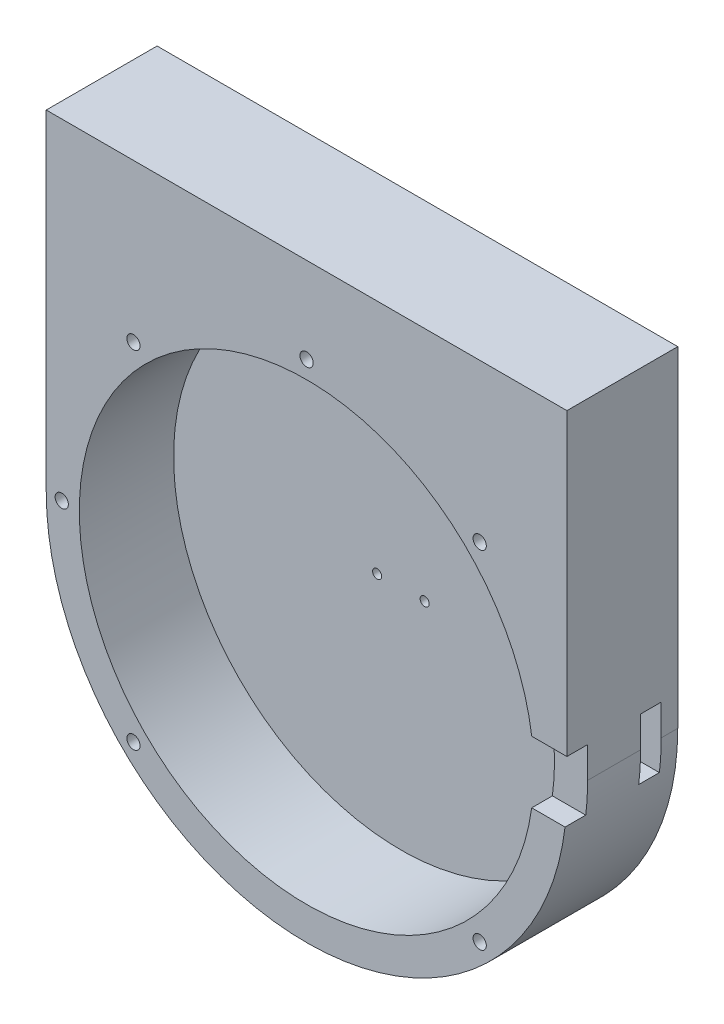
ISO-10303-21;
HEADER;
FILE_DESCRIPTION(('STEP AP214'),'2;1');
FILE_NAME('part.step','',(''),(''),'','','');
FILE_SCHEMA(('AUTOMOTIVE_DESIGN { 1 0 10303 214 1 1 1 1 }'));
ENDSEC;
DATA;
#1=APPLICATION_CONTEXT('core data for automotive mechanical design processes');
#2=APPLICATION_PROTOCOL_DEFINITION('international standard','automotive_design',2000,#1);
#3=PRODUCT_CONTEXT('',#1,'mechanical');
#4=PRODUCT('Part','Part','',(#3));
#5=PRODUCT_RELATED_PRODUCT_CATEGORY('part','',(#4));
#6=PRODUCT_DEFINITION_FORMATION('','',#4);
#7=PRODUCT_DEFINITION_CONTEXT('part definition',#1,'design');
#8=PRODUCT_DEFINITION('design','',#6,#7);
#9=PRODUCT_DEFINITION_SHAPE('','',#8);
#10=(LENGTH_UNIT() NAMED_UNIT(*) SI_UNIT(.MILLI.,.METRE.));
#11=(NAMED_UNIT(*) PLANE_ANGLE_UNIT() SI_UNIT($,.RADIAN.));
#12=(NAMED_UNIT(*) SI_UNIT($,.STERADIAN.) SOLID_ANGLE_UNIT());
#13=UNCERTAINTY_MEASURE_WITH_UNIT(LENGTH_MEASURE(1.E-05),#10,'distance_accuracy_value','');
#14=(GEOMETRIC_REPRESENTATION_CONTEXT(3) GLOBAL_UNCERTAINTY_ASSIGNED_CONTEXT((#13)) GLOBAL_UNIT_ASSIGNED_CONTEXT((#10,
#11,#12)) REPRESENTATION_CONTEXT('',''));
#15=CARTESIAN_POINT('',(0.,0.,0.));
#16=DIRECTION('',(0.,0.,1.));
#17=DIRECTION('',(1.,0.,0.));
#18=AXIS2_PLACEMENT_3D('',#15,#16,#17);
#19=CARTESIAN_POINT('',(0.,-1.18665937942703E-13,22.8250000000006));
#20=DIRECTION('',(0.,0.,-1.));
#21=DIRECTION('',(-0.707106781186544,0.70710678118655,0.));
#22=AXIS2_PLACEMENT_3D('',#19,#20,#21);
#23=PLANE('',#22);
#24=CARTESIAN_POINT('',(-41.8960767853027,41.896076785303,22.8250000000007));
#25=DIRECTION('',(0.,0.,-1.));
#26=DIRECTION('',(0.,1.,0.));
#27=AXIS2_PLACEMENT_3D('',#24,#25,#26);
#28=CIRCLE('',#27,1.6000000000001);
#29=CARTESIAN_POINT('',(-41.8960767853027,43.4960767853031,22.8250000000007));
#30=VERTEX_POINT('',#29);
#31=EDGE_CURVE('E344',#30,#30,#28,.F.);
#32=ORIENTED_EDGE('',*,*,#31,.F.);
#33=EDGE_LOOP('',(#32));
#34=FACE_BOUND('',#33,.T.);
#35=CARTESIAN_POINT('',(-41.8960767853031,-41.8960767853029,22.8250000000006));
#36=DIRECTION('',(0.,0.,-1.));
#37=DIRECTION('',(0.,1.,0.));
#38=AXIS2_PLACEMENT_3D('',#35,#36,#37);
#39=CIRCLE('',#38,1.60000000000007);
#40=CARTESIAN_POINT('',(-41.8960767853031,-40.2960767853028,22.8250000000006));
#41=VERTEX_POINT('',#40);
#42=EDGE_CURVE('E348',#41,#41,#39,.F.);
#43=ORIENTED_EDGE('',*,*,#42,.F.);
#44=EDGE_LOOP('',(#43));
#45=FACE_BOUND('',#44,.T.);
#46=CARTESIAN_POINT('',(41.8960767853028,-41.8960767853032,22.8250000000005));
#47=DIRECTION('',(0.,0.,-1.));
#48=DIRECTION('',(0.,1.,0.));
#49=AXIS2_PLACEMENT_3D('',#46,#47,#48);
#50=CIRCLE('',#49,1.60000000000006);
#51=CARTESIAN_POINT('',(41.8960767853028,-40.2960767853032,22.8250000000005));
#52=VERTEX_POINT('',#51);
#53=EDGE_CURVE('E352',#52,#52,#50,.F.);
#54=ORIENTED_EDGE('',*,*,#53,.F.);
#55=EDGE_LOOP('',(#54));
#56=FACE_BOUND('',#55,.T.);
#57=CARTESIAN_POINT('',(41.8960767853031,41.8960767853026,22.8250000000007));
#58=DIRECTION('',(0.,0.,-1.));
#59=DIRECTION('',(0.,1.,0.));
#60=AXIS2_PLACEMENT_3D('',#57,#58,#59);
#61=CIRCLE('',#60,1.60000000000009);
#62=CARTESIAN_POINT('',(41.8960767853031,43.4960767853027,22.8250000000007));
#63=VERTEX_POINT('',#62);
#64=EDGE_CURVE('E355',#63,#63,#61,.F.);
#65=ORIENTED_EDGE('',*,*,#64,.F.);
#66=EDGE_LOOP('',(#65));
#67=FACE_BOUND('',#66,.T.);
#68=CARTESIAN_POINT('',(0.,0.,22.8250000000006));
#69=DIRECTION('',(0.,0.,-1.));
#70=DIRECTION('',(0.,1.,0.));
#71=AXIS2_PLACEMENT_3D('',#68,#69,#70);
#72=CIRCLE('',#71,55.);
#73=CARTESIAN_POINT('',(54.4862367942584,-7.5,22.8250000000006));
#74=VERTEX_POINT('',#73);
#75=CARTESIAN_POINT('',(54.4862367942584,7.49999999999999,22.8250000000008));
#76=VERTEX_POINT('',#75);
#77=EDGE_CURVE('E11',#74,#76,#72,.T.);
#78=ORIENTED_EDGE('',*,*,#77,.T.);
#79=DIRECTION('',(1.,0.,0.));
#80=VECTOR('',#79,1.);
#81=CARTESIAN_POINT('',(-63.001,7.49999999999999,22.8250000000008));
#82=LINE('',#81,#80);
#83=CARTESIAN_POINT('',(63.,7.49999999999999,22.8250000000008));
#84=VERTEX_POINT('',#83);
#85=EDGE_CURVE('E208',#76,#84,#82,.T.);
#86=ORIENTED_EDGE('',*,*,#85,.T.);
#87=DIRECTION('',(0.,-1.,0.));
#88=VECTOR('',#87,1.);
#89=CARTESIAN_POINT('',(63.,80.0000000000004,22.8250000000008));
#90=LINE('',#89,#88);
#91=CARTESIAN_POINT('',(63.,80.,22.8250000000008));
#92=VERTEX_POINT('',#91);
#93=EDGE_CURVE('E258',#92,#84,#90,.T.);
#94=ORIENTED_EDGE('',*,*,#93,.F.);
#95=DIRECTION('',(1.,0.,0.));
#96=VECTOR('',#95,1.);
#97=CARTESIAN_POINT('',(-63.0000000000001,80.,22.8250000000008));
#98=LINE('',#97,#96);
#99=CARTESIAN_POINT('',(-63.,80.,22.8250000000008));
#100=VERTEX_POINT('',#99);
#101=EDGE_CURVE('E264',#100,#92,#98,.T.);
#102=ORIENTED_EDGE('',*,*,#101,.F.);
#103=DIRECTION('',(0.,1.,0.));
#104=VECTOR('',#103,1.);
#105=CARTESIAN_POINT('',(-63.,80.0000000000004,22.8250000000008));
#106=LINE('',#105,#104);
#107=CARTESIAN_POINT('',(-63.,0.,22.8250000000007));
#108=VERTEX_POINT('',#107);
#109=EDGE_CURVE('E254',#108,#100,#106,.T.);
#110=ORIENTED_EDGE('',*,*,#109,.F.);
#111=CARTESIAN_POINT('',(0.,0.,22.8250000000006));
#112=DIRECTION('',(0.,0.,-1.));
#113=DIRECTION('',(0.,1.,0.));
#114=AXIS2_PLACEMENT_3D('',#111,#112,#113);
#115=CIRCLE('',#114,63.);
#116=CARTESIAN_POINT('',(62.5519783859791,-7.5,22.8250000000008));
#117=VERTEX_POINT('',#116);
#118=EDGE_CURVE('E259',#117,#108,#115,.T.);
#119=ORIENTED_EDGE('',*,*,#118,.F.);
#120=DIRECTION('',(1.,0.,0.));
#121=VECTOR('',#120,1.);
#122=CARTESIAN_POINT('',(-63.001,-7.5,22.8250000000008));
#123=LINE('',#122,#121);
#124=EDGE_CURVE('E205',#74,#117,#123,.T.);
#125=ORIENTED_EDGE('',*,*,#124,.F.);
#126=EDGE_LOOP('',(#78,#86,#94,#102,#110,#119,#125));
#127=FACE_BOUND('',#126,.T.);
#128=CARTESIAN_POINT('',(-59.25,1.2490009027033E-13,22.8250000000007));
#129=DIRECTION('',(0.,0.,-1.));
#130=DIRECTION('',(0.,1.,0.));
#131=AXIS2_PLACEMENT_3D('',#128,#129,#130);
#132=CIRCLE('',#131,1.60000000000008);
#133=CARTESIAN_POINT('',(-57.6499999999999,1.2490009027033E-13,22.8250000000006));
#134=VERTEX_POINT('',#133);
#135=EDGE_CURVE('E538',#134,#134,#132,.T.);
#136=ORIENTED_EDGE('',*,*,#135,.T.);
#137=EDGE_LOOP('',(#136));
#138=FACE_BOUND('',#137,.T.);
#139=CARTESIAN_POINT('',(0.,59.2499999999999,22.8250000000008));
#140=DIRECTION('',(0.,0.,-1.));
#141=DIRECTION('',(0.,1.,0.));
#142=AXIS2_PLACEMENT_3D('',#139,#140,#141);
#143=CIRCLE('',#142,1.60000000000012);
#144=CARTESIAN_POINT('',(1.60000000000008,59.2499999999999,22.8250000000008));
#145=VERTEX_POINT('',#144);
#146=EDGE_CURVE('E539',#145,#145,#143,.T.);
#147=ORIENTED_EDGE('',*,*,#146,.T.);
#148=EDGE_LOOP('',(#147));
#149=FACE_BOUND('',#148,.T.);
#150=ADVANCED_FACE('F45',(#34,#45,#56,#67,#127,#138,#149),#23,.F.);
#151=CARTESIAN_POINT('',(-63.,80.,213.41618552546));
#152=DIRECTION('',(1.,0.,0.));
#153=DIRECTION('',(0.,0.,-1.));
#154=AXIS2_PLACEMENT_3D('',#151,#152,#153);
#155=PLANE('',#154);
#156=DIRECTION('',(0.,0.,-1.));
#157=VECTOR('',#156,1.);
#158=CARTESIAN_POINT('',(-63.,0.,213.41618552546));
#159=LINE('',#158,#157);
#160=CARTESIAN_POINT('',(-63.,0.,-4.));
#161=VERTEX_POINT('',#160);
#162=EDGE_CURVE('E255',#108,#161,#159,.T.);
#163=ORIENTED_EDGE('',*,*,#162,.F.);
#164=ORIENTED_EDGE('',*,*,#109,.T.);
#165=DIRECTION('',(0.,0.,-1.));
#166=VECTOR('',#165,1.);
#167=CARTESIAN_POINT('',(-63.,80.,213.41618552546));
#168=LINE('',#167,#166);
#169=CARTESIAN_POINT('',(-63.,80.,-4.));
#170=VERTEX_POINT('',#169);
#171=EDGE_CURVE('E267',#100,#170,#168,.T.);
#172=ORIENTED_EDGE('',*,*,#171,.T.);
#173=DIRECTION('',(0.,-1.,0.));
#174=VECTOR('',#173,1.);
#175=CARTESIAN_POINT('',(-63.,0.,-4.));
#176=LINE('',#175,#174);
#177=EDGE_CURVE('E167',#170,#161,#176,.T.);
#178=ORIENTED_EDGE('',*,*,#177,.T.);
#179=EDGE_LOOP('',(#163,#164,#172,#178));
#180=FACE_BOUND('',#179,.T.);
#181=ADVANCED_FACE('F290',(#180),#155,.F.);
#182=CARTESIAN_POINT('',(0.,0.,213.41618552546));
#183=DIRECTION('',(0.,0.,-1.));
#184=DIRECTION('',(-1.,0.,0.));
#185=AXIS2_PLACEMENT_3D('',#182,#183,#184);
#186=CYLINDRICAL_SURFACE('',#185,63.);
#187=CARTESIAN_POINT('',(0.,0.,17.8250000000008));
#188=DIRECTION('',(0.,0.,-1.));
#189=DIRECTION('',(0.,1.,0.));
#190=AXIS2_PLACEMENT_3D('',#187,#188,#189);
#191=CIRCLE('',#190,63.);
#192=CARTESIAN_POINT('',(62.5519783859791,-7.5,17.8250000000008));
#193=VERTEX_POINT('',#192);
#194=CARTESIAN_POINT('',(63.,0.,17.8250000000008));
#195=VERTEX_POINT('',#194);
#196=EDGE_CURVE('E183',#193,#195,#191,.F.);
#197=ORIENTED_EDGE('',*,*,#196,.F.);
#198=DIRECTION('',(0.,0.,-1.));
#199=VECTOR('',#198,1.);
#200=CARTESIAN_POINT('',(62.5519783859791,-7.50000000000003,213.41618552546));
#201=LINE('',#200,#199);
#202=EDGE_CURVE('E179',#117,#193,#201,.T.);
#203=ORIENTED_EDGE('',*,*,#202,.F.);
#204=ORIENTED_EDGE('',*,*,#118,.T.);
#205=ORIENTED_EDGE('',*,*,#162,.T.);
#206=CARTESIAN_POINT('',(0.,0.,-4.));
#207=DIRECTION('',(0.,0.,1.));
#208=DIRECTION('',(1.,0.,0.));
#209=AXIS2_PLACEMENT_3D('',#206,#207,#208);
#210=CIRCLE('',#209,63.);
#211=CARTESIAN_POINT('',(63.,0.,-4.));
#212=VERTEX_POINT('',#211);
#213=EDGE_CURVE('E165',#161,#212,#210,.T.);
#214=ORIENTED_EDGE('',*,*,#213,.T.);
#215=DIRECTION('',(0.,0.,1.));
#216=VECTOR('',#215,1.);
#217=CARTESIAN_POINT('',(63.,0.,-198.591185525459));
#218=LINE('',#217,#216);
#219=CARTESIAN_POINT('',(63.,0.,0.));
#220=VERTEX_POINT('',#219);
#221=EDGE_CURVE('E147',#212,#220,#218,.T.);
#222=ORIENTED_EDGE('',*,*,#221,.T.);
#223=CARTESIAN_POINT('',(0.,0.,0.));
#224=DIRECTION('',(0.,0.,-1.));
#225=DIRECTION('',(-1.,0.,0.));
#226=AXIS2_PLACEMENT_3D('',#223,#224,#225);
#227=CIRCLE('',#226,63.);
#228=CARTESIAN_POINT('',(62.5519783859791,-7.5,0.));
#229=VERTEX_POINT('',#228);
#230=EDGE_CURVE('E155',#220,#229,#227,.T.);
#231=ORIENTED_EDGE('',*,*,#230,.T.);
#232=DIRECTION('',(0.,0.,-1.));
#233=VECTOR('',#232,1.);
#234=CARTESIAN_POINT('',(62.5519783859791,-7.5,213.41618552546));
#235=LINE('',#234,#233);
#236=CARTESIAN_POINT('',(62.5519783859791,-7.5,5.));
#237=VERTEX_POINT('',#236);
#238=EDGE_CURVE('E246',#237,#229,#235,.T.);
#239=ORIENTED_EDGE('',*,*,#238,.F.);
#240=CARTESIAN_POINT('',(0.,0.,5.));
#241=DIRECTION('',(0.,0.,1.));
#242=DIRECTION('',(0.,-1.,0.));
#243=AXIS2_PLACEMENT_3D('',#240,#241,#242);
#244=CIRCLE('',#243,63.);
#245=CARTESIAN_POINT('',(63.,0.,5.));
#246=VERTEX_POINT('',#245);
#247=EDGE_CURVE('E184',#246,#237,#244,.F.);
#248=ORIENTED_EDGE('',*,*,#247,.F.);
#249=DIRECTION('',(0.,0.,-1.));
#250=VECTOR('',#249,1.);
#251=CARTESIAN_POINT('',(63.,0.,213.41618552546));
#252=LINE('',#251,#250);
#253=EDGE_CURVE('E260',#195,#246,#252,.T.);
#254=ORIENTED_EDGE('',*,*,#253,.F.);
#255=EDGE_LOOP('',(#197,#203,#204,#205,#214,#222,#231,#239,#248,#254));
#256=FACE_BOUND('',#255,.T.);
#257=ADVANCED_FACE('F161',(#256),#186,.T.);
#258=CARTESIAN_POINT('',(63.,80.,213.41618552546));
#259=DIRECTION('',(-1.,0.,0.));
#260=DIRECTION('',(0.,0.,1.));
#261=AXIS2_PLACEMENT_3D('',#258,#259,#260);
#262=PLANE('',#261);
#263=ORIENTED_EDGE('',*,*,#93,.T.);
#264=DIRECTION('',(0.,0.,1.));
#265=VECTOR('',#264,1.);
#266=CARTESIAN_POINT('',(63.,7.5,17.8250000000008));
#267=LINE('',#266,#265);
#268=CARTESIAN_POINT('',(63.,7.5,17.8250000000008));
#269=VERTEX_POINT('',#268);
#270=EDGE_CURVE('E197',#269,#84,#267,.T.);
#271=ORIENTED_EDGE('',*,*,#270,.F.);
#272=DIRECTION('',(0.,1.,0.));
#273=VECTOR('',#272,1.);
#274=CARTESIAN_POINT('',(63.,-7.5,17.8250000000008));
#275=LINE('',#274,#273);
#276=EDGE_CURVE('E193',#195,#269,#275,.T.);
#277=ORIENTED_EDGE('',*,*,#276,.F.);
#278=ORIENTED_EDGE('',*,*,#253,.T.);
#279=DIRECTION('',(0.,-1.,0.));
#280=VECTOR('',#279,1.);
#281=CARTESIAN_POINT('',(63.,7.5,5.));
#282=LINE('',#281,#280);
#283=CARTESIAN_POINT('',(63.,7.5,5.));
#284=VERTEX_POINT('',#283);
#285=EDGE_CURVE('E226',#284,#246,#282,.T.);
#286=ORIENTED_EDGE('',*,*,#285,.F.);
#287=DIRECTION('',(0.,0.,1.));
#288=VECTOR('',#287,1.);
#289=CARTESIAN_POINT('',(63.,7.5,0.));
#290=LINE('',#289,#288);
#291=CARTESIAN_POINT('',(63.,7.5,0.));
#292=VERTEX_POINT('',#291);
#293=EDGE_CURVE('E150',#292,#284,#290,.T.);
#294=ORIENTED_EDGE('',*,*,#293,.F.);
#295=DIRECTION('',(0.,-1.,0.));
#296=VECTOR('',#295,1.);
#297=CARTESIAN_POINT('',(63.,80.,0.));
#298=LINE('',#297,#296);
#299=EDGE_CURVE('E142',#292,#220,#298,.T.);
#300=ORIENTED_EDGE('',*,*,#299,.T.);
#301=ORIENTED_EDGE('',*,*,#221,.F.);
#302=DIRECTION('',(0.,1.,0.));
#303=VECTOR('',#302,1.);
#304=CARTESIAN_POINT('',(63.,80.,-4.));
#305=LINE('',#304,#303);
#306=CARTESIAN_POINT('',(63.,80.,-4.));
#307=VERTEX_POINT('',#306);
#308=EDGE_CURVE('E295',#212,#307,#305,.T.);
#309=ORIENTED_EDGE('',*,*,#308,.T.);
#310=DIRECTION('',(0.,0.,-1.));
#311=VECTOR('',#310,1.);
#312=CARTESIAN_POINT('',(63.,80.,213.41618552546));
#313=LINE('',#312,#311);
#314=EDGE_CURVE('E53',#92,#307,#313,.T.);
#315=ORIENTED_EDGE('',*,*,#314,.F.);
#316=EDGE_LOOP('',(#263,#271,#277,#278,#286,#294,#300,#301,#309,#315));
#317=FACE_BOUND('',#316,.T.);
#318=ADVANCED_FACE('F145',(#317),#262,.F.);
#319=CARTESIAN_POINT('',(-63.,80.,213.41618552546));
#320=DIRECTION('',(0.,-1.,0.));
#321=DIRECTION('',(0.,0.,-1.));
#322=AXIS2_PLACEMENT_3D('',#319,#320,#321);
#323=PLANE('',#322);
#324=ORIENTED_EDGE('',*,*,#171,.F.);
#325=ORIENTED_EDGE('',*,*,#101,.T.);
#326=ORIENTED_EDGE('',*,*,#314,.T.);
#327=DIRECTION('',(-1.,0.,0.));
#328=VECTOR('',#327,1.);
#329=CARTESIAN_POINT('',(-63.,80.,-4.));
#330=LINE('',#329,#328);
#331=EDGE_CURVE('E223',#307,#170,#330,.T.);
#332=ORIENTED_EDGE('',*,*,#331,.T.);
#333=EDGE_LOOP('',(#324,#325,#326,#332));
#334=FACE_BOUND('',#333,.T.);
#335=ADVANCED_FACE('F280',(#334),#323,.F.);
#336=CARTESIAN_POINT('',(0.,0.,213.41618552546));
#337=DIRECTION('',(0.,0.,-1.));
#338=DIRECTION('',(-1.,0.,0.));
#339=AXIS2_PLACEMENT_3D('',#336,#337,#338);
#340=CYLINDRICAL_SURFACE('',#339,55.);
#341=DIRECTION('',(0.,0.,-1.));
#342=VECTOR('',#341,1.);
#343=CARTESIAN_POINT('',(54.4862367942585,7.49999999999963,213.41618552546));
#344=LINE('',#343,#342);
#345=CARTESIAN_POINT('',(54.4862367942585,7.49999999999963,17.8250000000008));
#346=VERTEX_POINT('',#345);
#347=EDGE_CURVE('E204',#346,#76,#344,.F.);
#348=ORIENTED_EDGE('',*,*,#347,.T.);
#349=ORIENTED_EDGE('',*,*,#77,.F.);
#350=DIRECTION('',(0.,0.,-1.));
#351=VECTOR('',#350,1.);
#352=CARTESIAN_POINT('',(54.4862367942584,-7.50000000000003,213.41618552546));
#353=LINE('',#352,#351);
#354=CARTESIAN_POINT('',(54.4862367942584,-7.5,17.8250000000008));
#355=VERTEX_POINT('',#354);
#356=EDGE_CURVE('E68',#74,#355,#353,.T.);
#357=ORIENTED_EDGE('',*,*,#356,.T.);
#358=CARTESIAN_POINT('',(0.,0.,17.8250000000008));
#359=DIRECTION('',(0.,0.,-1.));
#360=DIRECTION('',(0.,1.,0.));
#361=AXIS2_PLACEMENT_3D('',#358,#359,#360);
#362=CIRCLE('',#361,55.);
#363=EDGE_CURVE('E187',#355,#346,#362,.F.);
#364=ORIENTED_EDGE('',*,*,#363,.T.);
#365=EDGE_LOOP('',(#348,#349,#357,#364));
#366=FACE_BOUND('',#365,.T.);
#367=DIRECTION('',(0.,0.,-1.));
#368=VECTOR('',#367,1.);
#369=CARTESIAN_POINT('',(54.4862367942584,-7.5,213.41618552546));
#370=LINE('',#369,#368);
#371=CARTESIAN_POINT('',(54.4862367942584,-7.5,5.));
#372=VERTEX_POINT('',#371);
#373=CARTESIAN_POINT('',(54.4862367942584,-7.5,0.));
#374=VERTEX_POINT('',#373);
#375=EDGE_CURVE('E242',#372,#374,#370,.T.);
#376=ORIENTED_EDGE('',*,*,#375,.T.);
#377=CARTESIAN_POINT('',(0.,0.,0.));
#378=DIRECTION('',(0.,0.,1.));
#379=DIRECTION('',(1.,0.,0.));
#380=AXIS2_PLACEMENT_3D('',#377,#378,#379);
#381=CIRCLE('',#380,55.);
#382=CARTESIAN_POINT('',(54.4862367942584,7.5,0.));
#383=VERTEX_POINT('',#382);
#384=EDGE_CURVE('E217',#383,#374,#381,.T.);
#385=ORIENTED_EDGE('',*,*,#384,.F.);
#386=DIRECTION('',(0.,0.,-1.));
#387=VECTOR('',#386,1.);
#388=CARTESIAN_POINT('',(54.4862367942584,7.49999999999993,213.41618552546));
#389=LINE('',#388,#387);
#390=CARTESIAN_POINT('',(54.4862367942584,7.49999999999993,5.));
#391=VERTEX_POINT('',#390);
#392=EDGE_CURVE('E238',#383,#391,#389,.F.);
#393=ORIENTED_EDGE('',*,*,#392,.T.);
#394=CARTESIAN_POINT('',(0.,0.,5.));
#395=DIRECTION('',(0.,0.,1.));
#396=DIRECTION('',(0.,-1.,0.));
#397=AXIS2_PLACEMENT_3D('',#394,#395,#396);
#398=CIRCLE('',#397,55.);
#399=EDGE_CURVE('E218',#391,#372,#398,.F.);
#400=ORIENTED_EDGE('',*,*,#399,.T.);
#401=EDGE_LOOP('',(#376,#385,#393,#400));
#402=FACE_BOUND('',#401,.T.);
#403=ADVANCED_FACE('F312',(#366,#402),#340,.F.);
#404=CARTESIAN_POINT('',(-63.001,7.5,17.8250000000008));
#405=DIRECTION('',(0.,1.,0.));
#406=DIRECTION('',(0.,0.,1.));
#407=AXIS2_PLACEMENT_3D('',#404,#405,#406);
#408=PLANE('',#407);
#409=DIRECTION('',(1.,0.,0.));
#410=VECTOR('',#409,1.);
#411=CARTESIAN_POINT('',(-63.001,7.5,17.8250000000008));
#412=LINE('',#411,#410);
#413=EDGE_CURVE('E200',#346,#269,#412,.T.);
#414=ORIENTED_EDGE('',*,*,#413,.T.);
#415=ORIENTED_EDGE('',*,*,#270,.T.);
#416=ORIENTED_EDGE('',*,*,#85,.F.);
#417=ORIENTED_EDGE('',*,*,#347,.F.);
#418=EDGE_LOOP('',(#414,#415,#416,#417));
#419=FACE_BOUND('',#418,.T.);
#420=ADVANCED_FACE('F308',(#419),#408,.F.);
#421=CARTESIAN_POINT('',(-63.001,-7.5,17.8250000000008));
#422=DIRECTION('',(0.,-1.,0.));
#423=DIRECTION('',(0.,0.,-1.));
#424=AXIS2_PLACEMENT_3D('',#421,#422,#423);
#425=PLANE('',#424);
#426=ORIENTED_EDGE('',*,*,#202,.T.);
#427=DIRECTION('',(1.,0.,0.));
#428=VECTOR('',#427,1.);
#429=CARTESIAN_POINT('',(-63.001,-7.5,17.8250000000008));
#430=LINE('',#429,#428);
#431=EDGE_CURVE('E201',#355,#193,#430,.T.);
#432=ORIENTED_EDGE('',*,*,#431,.F.);
#433=ORIENTED_EDGE('',*,*,#356,.F.);
#434=ORIENTED_EDGE('',*,*,#124,.T.);
#435=EDGE_LOOP('',(#426,#432,#433,#434));
#436=FACE_BOUND('',#435,.T.);
#437=ADVANCED_FACE('F330',(#436),#425,.F.);
#438=CARTESIAN_POINT('',(-63.001,-7.5,17.8250000000008));
#439=DIRECTION('',(0.,0.,-1.));
#440=DIRECTION('',(0.,1.,0.));
#441=AXIS2_PLACEMENT_3D('',#438,#439,#440);
#442=PLANE('',#441);
#443=ORIENTED_EDGE('',*,*,#196,.T.);
#444=ORIENTED_EDGE('',*,*,#276,.T.);
#445=ORIENTED_EDGE('',*,*,#413,.F.);
#446=ORIENTED_EDGE('',*,*,#363,.F.);
#447=ORIENTED_EDGE('',*,*,#431,.T.);
#448=EDGE_LOOP('',(#443,#444,#445,#446,#447));
#449=FACE_BOUND('',#448,.T.);
#450=ADVANCED_FACE('F315',(#449),#442,.F.);
#451=CARTESIAN_POINT('',(-63.001,7.5,5.));
#452=DIRECTION('',(0.,0.,1.));
#453=DIRECTION('',(0.,-1.,0.));
#454=AXIS2_PLACEMENT_3D('',#451,#452,#453);
#455=PLANE('',#454);
#456=ORIENTED_EDGE('',*,*,#247,.T.);
#457=DIRECTION('',(1.,0.,0.));
#458=VECTOR('',#457,1.);
#459=CARTESIAN_POINT('',(-63.001,-7.5,5.));
#460=LINE('',#459,#458);
#461=EDGE_CURVE('E227',#372,#237,#460,.T.);
#462=ORIENTED_EDGE('',*,*,#461,.F.);
#463=ORIENTED_EDGE('',*,*,#399,.F.);
#464=DIRECTION('',(1.,0.,0.));
#465=VECTOR('',#464,1.);
#466=CARTESIAN_POINT('',(-63.001,7.5,5.));
#467=LINE('',#466,#465);
#468=EDGE_CURVE('E60',#391,#284,#467,.T.);
#469=ORIENTED_EDGE('',*,*,#468,.T.);
#470=ORIENTED_EDGE('',*,*,#285,.T.);
#471=EDGE_LOOP('',(#456,#462,#463,#469,#470));
#472=FACE_BOUND('',#471,.T.);
#473=ADVANCED_FACE('F318',(#472),#455,.F.);
#474=CARTESIAN_POINT('',(-63.001,-7.5,5.));
#475=DIRECTION('',(0.,-1.,0.));
#476=DIRECTION('',(0.,0.,-1.));
#477=AXIS2_PLACEMENT_3D('',#474,#475,#476);
#478=PLANE('',#477);
#479=ORIENTED_EDGE('',*,*,#238,.T.);
#480=DIRECTION('',(1.,0.,0.));
#481=VECTOR('',#480,1.);
#482=CARTESIAN_POINT('',(-63.001,-7.5,0.));
#483=LINE('',#482,#481);
#484=EDGE_CURVE('E171',#374,#229,#483,.T.);
#485=ORIENTED_EDGE('',*,*,#484,.F.);
#486=ORIENTED_EDGE('',*,*,#375,.F.);
#487=ORIENTED_EDGE('',*,*,#461,.T.);
#488=EDGE_LOOP('',(#479,#485,#486,#487));
#489=FACE_BOUND('',#488,.T.);
#490=ADVANCED_FACE('F323',(#489),#478,.F.);
#491=CARTESIAN_POINT('',(-63.001,7.5,0.));
#492=DIRECTION('',(0.,1.,0.));
#493=DIRECTION('',(0.,0.,1.));
#494=AXIS2_PLACEMENT_3D('',#491,#492,#493);
#495=PLANE('',#494);
#496=DIRECTION('',(1.,0.,0.));
#497=VECTOR('',#496,1.);
#498=CARTESIAN_POINT('',(-63.001,7.5,0.));
#499=LINE('',#498,#497);
#500=EDGE_CURVE('E222',#383,#292,#499,.T.);
#501=ORIENTED_EDGE('',*,*,#500,.T.);
#502=ORIENTED_EDGE('',*,*,#293,.T.);
#503=ORIENTED_EDGE('',*,*,#468,.F.);
#504=ORIENTED_EDGE('',*,*,#392,.F.);
#505=EDGE_LOOP('',(#501,#502,#503,#504));
#506=FACE_BOUND('',#505,.T.);
#507=ADVANCED_FACE('F320',(#506),#495,.F.);
#508=CARTESIAN_POINT('',(0.,0.,0.));
#509=DIRECTION('',(0.,0.,-1.));
#510=DIRECTION('',(-1.,0.,0.));
#511=AXIS2_PLACEMENT_3D('',#508,#509,#510);
#512=PLANE('',#511);
#513=CARTESIAN_POINT('',(5.75,0.,0.));
#514=DIRECTION('',(0.,0.,-1.));
#515=DIRECTION('',(-1.,0.,0.));
#516=AXIS2_PLACEMENT_3D('',#513,#514,#515);
#517=CIRCLE('',#516,1.10000000000001);
#518=CARTESIAN_POINT('',(4.64999999999999,0.,0.));
#519=VERTEX_POINT('',#518);
#520=EDGE_CURVE('E156',#519,#519,#517,.F.);
#521=ORIENTED_EDGE('',*,*,#520,.F.);
#522=EDGE_LOOP('',(#521));
#523=FACE_BOUND('',#522,.T.);
#524=CARTESIAN_POINT('',(-5.75,0.,0.));
#525=DIRECTION('',(0.,0.,-1.));
#526=DIRECTION('',(-1.,0.,0.));
#527=AXIS2_PLACEMENT_3D('',#524,#525,#526);
#528=CIRCLE('',#527,1.1);
#529=CARTESIAN_POINT('',(-6.85,0.,0.));
#530=VERTEX_POINT('',#529);
#531=EDGE_CURVE('E358',#530,#530,#528,.F.);
#532=ORIENTED_EDGE('',*,*,#531,.F.);
#533=EDGE_LOOP('',(#532));
#534=FACE_BOUND('',#533,.T.);
#535=ORIENTED_EDGE('',*,*,#384,.T.);
#536=ORIENTED_EDGE('',*,*,#484,.T.);
#537=ORIENTED_EDGE('',*,*,#230,.F.);
#538=ORIENTED_EDGE('',*,*,#299,.F.);
#539=ORIENTED_EDGE('',*,*,#500,.F.);
#540=EDGE_LOOP('',(#535,#536,#537,#538,#539));
#541=FACE_BOUND('',#540,.T.);
#542=ADVANCED_FACE('F169',(#523,#534,#541),#512,.F.);
#543=CARTESIAN_POINT('',(0.,-0.01892492878625,-4.));
#544=DIRECTION('',(0.,0.,1.));
#545=DIRECTION('',(1.,0.,0.));
#546=AXIS2_PLACEMENT_3D('',#543,#544,#545);
#547=PLANE('',#546);
#548=CARTESIAN_POINT('',(-41.8960767853027,41.896076785303,-4.));
#549=DIRECTION('',(0.,0.,-1.));
#550=DIRECTION('',(-1.,0.,0.));
#551=AXIS2_PLACEMENT_3D('',#548,#549,#550);
#552=CIRCLE('',#551,1.6000000000001);
#553=CARTESIAN_POINT('',(-43.4960767853028,41.896076785303,-4.));
#554=VERTEX_POINT('',#553);
#555=EDGE_CURVE('E562',#554,#554,#552,.T.);
#556=ORIENTED_EDGE('',*,*,#555,.F.);
#557=EDGE_LOOP('',(#556));
#558=FACE_BOUND('',#557,.T.);
#559=CARTESIAN_POINT('',(-41.8960767853031,-41.8960767853029,-4.));
#560=DIRECTION('',(0.,0.,-1.));
#561=DIRECTION('',(-1.,0.,0.));
#562=AXIS2_PLACEMENT_3D('',#559,#560,#561);
#563=CIRCLE('',#562,1.60000000000007);
#564=CARTESIAN_POINT('',(-43.4960767853032,-41.8960767853029,-4.));
#565=VERTEX_POINT('',#564);
#566=EDGE_CURVE('E556',#565,#565,#563,.T.);
#567=ORIENTED_EDGE('',*,*,#566,.F.);
#568=EDGE_LOOP('',(#567));
#569=FACE_BOUND('',#568,.T.);
#570=CARTESIAN_POINT('',(41.8960767853028,-41.8960767853032,-4.));
#571=DIRECTION('',(0.,0.,-1.));
#572=DIRECTION('',(-1.,0.,0.));
#573=AXIS2_PLACEMENT_3D('',#570,#571,#572);
#574=CIRCLE('',#573,1.60000000000006);
#575=CARTESIAN_POINT('',(40.2960767853027,-41.8960767853032,-4.));
#576=VERTEX_POINT('',#575);
#577=EDGE_CURVE('E550',#576,#576,#574,.T.);
#578=ORIENTED_EDGE('',*,*,#577,.F.);
#579=EDGE_LOOP('',(#578));
#580=FACE_BOUND('',#579,.T.);
#581=CARTESIAN_POINT('',(41.8960767853031,41.8960767853026,-4.));
#582=DIRECTION('',(0.,0.,-1.));
#583=DIRECTION('',(-1.,0.,0.));
#584=AXIS2_PLACEMENT_3D('',#581,#582,#583);
#585=CIRCLE('',#584,1.60000000000009);
#586=CARTESIAN_POINT('',(40.2960767853031,41.8960767853026,-4.));
#587=VERTEX_POINT('',#586);
#588=EDGE_CURVE('E359',#587,#587,#585,.T.);
#589=ORIENTED_EDGE('',*,*,#588,.F.);
#590=EDGE_LOOP('',(#589));
#591=FACE_BOUND('',#590,.T.);
#592=CARTESIAN_POINT('',(5.75,0.,-4.));
#593=DIRECTION('',(0.,0.,-1.));
#594=DIRECTION('',(-1.,0.,0.));
#595=AXIS2_PLACEMENT_3D('',#592,#593,#594);
#596=CIRCLE('',#595,1.10000000000001);
#597=CARTESIAN_POINT('',(4.64999999999999,0.,-4.));
#598=VERTEX_POINT('',#597);
#599=EDGE_CURVE('E368',#598,#598,#596,.T.);
#600=ORIENTED_EDGE('',*,*,#599,.F.);
#601=EDGE_LOOP('',(#600));
#602=FACE_BOUND('',#601,.T.);
#603=CARTESIAN_POINT('',(-5.75,0.,-4.));
#604=DIRECTION('',(0.,0.,-1.));
#605=DIRECTION('',(-1.,0.,0.));
#606=AXIS2_PLACEMENT_3D('',#603,#604,#605);
#607=CIRCLE('',#606,1.1);
#608=CARTESIAN_POINT('',(-6.85,0.,-4.));
#609=VERTEX_POINT('',#608);
#610=EDGE_CURVE('E301',#609,#609,#607,.T.);
#611=ORIENTED_EDGE('',*,*,#610,.F.);
#612=EDGE_LOOP('',(#611));
#613=FACE_BOUND('',#612,.T.);
#614=ORIENTED_EDGE('',*,*,#308,.F.);
#615=ORIENTED_EDGE('',*,*,#213,.F.);
#616=ORIENTED_EDGE('',*,*,#177,.F.);
#617=ORIENTED_EDGE('',*,*,#331,.F.);
#618=EDGE_LOOP('',(#614,#615,#616,#617));
#619=FACE_BOUND('',#618,.T.);
#620=ADVANCED_FACE('F294',(#558,#569,#580,#591,#602,#613,#619),#547,.F.);
#621=CARTESIAN_POINT('',(-5.75,0.,22.8260000000008));
#622=DIRECTION('',(0.,0.,-1.));
#623=DIRECTION('',(-1.,0.,0.));
#624=AXIS2_PLACEMENT_3D('',#621,#622,#623);
#625=CYLINDRICAL_SURFACE('',#624,1.1);
#626=ORIENTED_EDGE('',*,*,#610,.T.);
#627=EDGE_LOOP('',(#626));
#628=FACE_BOUND('',#627,.T.);
#629=ORIENTED_EDGE('',*,*,#531,.T.);
#630=EDGE_LOOP('',(#629));
#631=FACE_BOUND('',#630,.T.);
#632=ADVANCED_FACE('F383',(#628,#631),#625,.F.);
#633=CARTESIAN_POINT('',(5.75,0.,22.8260000000008));
#634=DIRECTION('',(0.,0.,-1.));
#635=DIRECTION('',(-1.,0.,0.));
#636=AXIS2_PLACEMENT_3D('',#633,#634,#635);
#637=CYLINDRICAL_SURFACE('',#636,1.10000000000001);
#638=ORIENTED_EDGE('',*,*,#599,.T.);
#639=EDGE_LOOP('',(#638));
#640=FACE_BOUND('',#639,.T.);
#641=ORIENTED_EDGE('',*,*,#520,.T.);
#642=EDGE_LOOP('',(#641));
#643=FACE_BOUND('',#642,.T.);
#644=ADVANCED_FACE('F376',(#640,#643),#637,.F.);
#645=CARTESIAN_POINT('',(41.8960767853031,41.8960767853026,22.8260000000008));
#646=DIRECTION('',(0.,0.,-1.));
#647=DIRECTION('',(-1.,0.,0.));
#648=AXIS2_PLACEMENT_3D('',#645,#646,#647);
#649=CYLINDRICAL_SURFACE('',#648,1.60000000000009);
#650=ORIENTED_EDGE('',*,*,#588,.T.);
#651=EDGE_LOOP('',(#650));
#652=FACE_BOUND('',#651,.T.);
#653=ORIENTED_EDGE('',*,*,#64,.T.);
#654=EDGE_LOOP('',(#653));
#655=FACE_BOUND('',#654,.T.);
#656=ADVANCED_FACE('F390',(#652,#655),#649,.F.);
#657=CARTESIAN_POINT('',(41.8960767853028,-41.8960767853032,22.8260000000008));
#658=DIRECTION('',(0.,0.,-1.));
#659=DIRECTION('',(-1.,0.,0.));
#660=AXIS2_PLACEMENT_3D('',#657,#658,#659);
#661=CYLINDRICAL_SURFACE('',#660,1.60000000000006);
#662=ORIENTED_EDGE('',*,*,#577,.T.);
#663=EDGE_LOOP('',(#662));
#664=FACE_BOUND('',#663,.T.);
#665=ORIENTED_EDGE('',*,*,#53,.T.);
#666=EDGE_LOOP('',(#665));
#667=FACE_BOUND('',#666,.T.);
#668=ADVANCED_FACE('F458',(#664,#667),#661,.F.);
#669=CARTESIAN_POINT('',(-41.8960767853031,-41.8960767853029,22.8260000000008));
#670=DIRECTION('',(0.,0.,-1.));
#671=DIRECTION('',(-1.,0.,0.));
#672=AXIS2_PLACEMENT_3D('',#669,#670,#671);
#673=CYLINDRICAL_SURFACE('',#672,1.60000000000007);
#674=ORIENTED_EDGE('',*,*,#566,.T.);
#675=EDGE_LOOP('',(#674));
#676=FACE_BOUND('',#675,.T.);
#677=ORIENTED_EDGE('',*,*,#42,.T.);
#678=EDGE_LOOP('',(#677));
#679=FACE_BOUND('',#678,.T.);
#680=ADVANCED_FACE('F467',(#676,#679),#673,.F.);
#681=CARTESIAN_POINT('',(-41.8960767853027,41.896076785303,22.8260000000008));
#682=DIRECTION('',(0.,0.,-1.));
#683=DIRECTION('',(-1.,0.,0.));
#684=AXIS2_PLACEMENT_3D('',#681,#682,#683);
#685=CYLINDRICAL_SURFACE('',#684,1.6000000000001);
#686=ORIENTED_EDGE('',*,*,#555,.T.);
#687=EDGE_LOOP('',(#686));
#688=FACE_BOUND('',#687,.T.);
#689=ORIENTED_EDGE('',*,*,#31,.T.);
#690=EDGE_LOOP('',(#689));
#691=FACE_BOUND('',#690,.T.);
#692=ADVANCED_FACE('F477',(#688,#691),#685,.F.);
#693=CARTESIAN_POINT('',(-59.25,1.2490009027033E-13,19.8250000000007));
#694=DIRECTION('',(0.,0.,1.));
#695=DIRECTION('',(1.,0.,0.));
#696=AXIS2_PLACEMENT_3D('',#693,#694,#695);
#697=CYLINDRICAL_SURFACE('',#696,1.60000000000008);
#698=CARTESIAN_POINT('',(-59.25,1.2490009027033E-13,19.8250000000007));
#699=DIRECTION('',(0.,0.,-1.));
#700=DIRECTION('',(0.,1.,0.));
#701=AXIS2_PLACEMENT_3D('',#698,#699,#700);
#702=CIRCLE('',#701,1.60000000000008);
#703=CARTESIAN_POINT('',(-57.6499999999999,1.2490009027033E-13,19.8250000000007));
#704=VERTEX_POINT('',#703);
#705=EDGE_CURVE('E544',#704,#704,#702,.T.);
#706=CARTESIAN_POINT('',(-57.6499999999999,1.2490009027033E-13,19.8250000000007));
#707=CARTESIAN_POINT('',(-57.6499999999999,1.2490009027033E-13,19.8562500000007));
#708=CARTESIAN_POINT('',(-57.6499999999999,1.2490009027033E-13,19.8875000000006));
#709=CARTESIAN_POINT('',(-57.6499999999999,1.2490009027033E-13,19.9500000000007));
#710=CARTESIAN_POINT('',(-57.6499999999999,1.2490009027033E-13,19.9812500000007));
#711=CARTESIAN_POINT('',(-57.6499999999999,1.2490009027033E-13,20.0437500000007));
#712=CARTESIAN_POINT('',(-57.6499999999999,1.2490009027033E-13,20.0750000000007));
#713=CARTESIAN_POINT('',(-57.6499999999999,1.2490009027033E-13,20.1375000000007));
#714=CARTESIAN_POINT('',(-57.6499999999999,1.2490009027033E-13,20.1687500000007));
#715=CARTESIAN_POINT('',(-57.6499999999999,1.2490009027033E-13,20.2312500000007));
#716=CARTESIAN_POINT('',(-57.6499999999999,1.2490009027033E-13,20.2625000000007));
#717=CARTESIAN_POINT('',(-57.6499999999999,1.2490009027033E-13,20.3250000000007));
#718=CARTESIAN_POINT('',(-57.6499999999999,1.2490009027033E-13,20.3562500000007));
#719=CARTESIAN_POINT('',(-57.6499999999999,1.2490009027033E-13,20.4187500000007));
#720=CARTESIAN_POINT('',(-57.6499999999999,1.2490009027033E-13,20.4500000000007));
#721=CARTESIAN_POINT('',(-57.6499999999999,1.2490009027033E-13,20.5125000000007));
#722=CARTESIAN_POINT('',(-57.6499999999999,1.2490009027033E-13,20.5437500000007));
#723=CARTESIAN_POINT('',(-57.6499999999999,1.2490009027033E-13,20.6062500000007));
#724=CARTESIAN_POINT('',(-57.6499999999999,1.2490009027033E-13,20.6375000000007));
#725=CARTESIAN_POINT('',(-57.6499999999999,1.2490009027033E-13,20.7000000000007));
#726=CARTESIAN_POINT('',(-57.6499999999999,1.2490009027033E-13,20.7312500000007));
#727=CARTESIAN_POINT('',(-57.6499999999999,1.2490009027033E-13,20.7937500000007));
#728=CARTESIAN_POINT('',(-57.6499999999999,1.2490009027033E-13,20.8250000000007));
#729=CARTESIAN_POINT('',(-57.6499999999999,1.2490009027033E-13,20.8875000000007));
#730=CARTESIAN_POINT('',(-57.6499999999999,1.2490009027033E-13,20.9187500000007));
#731=CARTESIAN_POINT('',(-57.6499999999999,1.2490009027033E-13,20.9812500000007));
#732=CARTESIAN_POINT('',(-57.6499999999999,1.2490009027033E-13,21.0125000000007));
#733=CARTESIAN_POINT('',(-57.6499999999999,1.2490009027033E-13,21.0750000000007));
#734=CARTESIAN_POINT('',(-57.6499999999999,1.2490009027033E-13,21.1062500000007));
#735=CARTESIAN_POINT('',(-57.6499999999999,1.2490009027033E-13,21.1687500000007));
#736=CARTESIAN_POINT('',(-57.6499999999999,1.2490009027033E-13,21.2000000000007));
#737=CARTESIAN_POINT('',(-57.6499999999999,1.2490009027033E-13,21.2625000000007));
#738=CARTESIAN_POINT('',(-57.6499999999999,1.2490009027033E-13,21.2937500000007));
#739=CARTESIAN_POINT('',(-57.6499999999999,1.2490009027033E-13,21.3562500000007));
#740=CARTESIAN_POINT('',(-57.6499999999999,1.2490009027033E-13,21.3875000000007));
#741=CARTESIAN_POINT('',(-57.6499999999999,1.2490009027033E-13,21.4500000000007));
#742=CARTESIAN_POINT('',(-57.6499999999999,1.2490009027033E-13,21.4812500000007));
#743=CARTESIAN_POINT('',(-57.6499999999999,1.2490009027033E-13,21.5437500000007));
#744=CARTESIAN_POINT('',(-57.6499999999999,1.2490009027033E-13,21.5750000000007));
#745=CARTESIAN_POINT('',(-57.6499999999999,1.2490009027033E-13,21.6375000000007));
#746=CARTESIAN_POINT('',(-57.6499999999999,1.2490009027033E-13,21.6687500000007));
#747=CARTESIAN_POINT('',(-57.6499999999999,1.2490009027033E-13,21.7312500000007));
#748=CARTESIAN_POINT('',(-57.6499999999999,1.2490009027033E-13,21.7625000000007));
#749=CARTESIAN_POINT('',(-57.6499999999999,1.2490009027033E-13,21.8250000000007));
#750=CARTESIAN_POINT('',(-57.6499999999999,1.2490009027033E-13,21.8562500000007));
#751=CARTESIAN_POINT('',(-57.6499999999999,1.2490009027033E-13,21.9187500000007));
#752=CARTESIAN_POINT('',(-57.6499999999999,1.2490009027033E-13,21.9500000000007));
#753=CARTESIAN_POINT('',(-57.6499999999999,1.2490009027033E-13,22.0125000000007));
#754=CARTESIAN_POINT('',(-57.6499999999999,1.2490009027033E-13,22.0437500000007));
#755=CARTESIAN_POINT('',(-57.6499999999999,1.2490009027033E-13,22.1062500000007));
#756=CARTESIAN_POINT('',(-57.6499999999999,1.2490009027033E-13,22.1375000000007));
#757=CARTESIAN_POINT('',(-57.6499999999999,1.2490009027033E-13,22.2000000000007));
#758=CARTESIAN_POINT('',(-57.6499999999999,1.2490009027033E-13,22.2312500000007));
#759=CARTESIAN_POINT('',(-57.6499999999999,1.2490009027033E-13,22.2937500000007));
#760=CARTESIAN_POINT('',(-57.6499999999999,1.2490009027033E-13,22.3250000000007));
#761=CARTESIAN_POINT('',(-57.6499999999999,1.2490009027033E-13,22.3875000000007));
#762=CARTESIAN_POINT('',(-57.6499999999999,1.2490009027033E-13,22.4187500000007));
#763=CARTESIAN_POINT('',(-57.6499999999999,1.2490009027033E-13,22.4812500000007));
#764=CARTESIAN_POINT('',(-57.6499999999999,1.2490009027033E-13,22.5125000000007));
#765=CARTESIAN_POINT('',(-57.6499999999999,1.2490009027033E-13,22.5750000000007));
#766=CARTESIAN_POINT('',(-57.6499999999999,1.2490009027033E-13,22.6062500000006));
#767=CARTESIAN_POINT('',(-57.6499999999999,1.2490009027033E-13,22.6687500000006));
#768=CARTESIAN_POINT('',(-57.6499999999999,1.2490009027033E-13,22.7000000000007));
#769=CARTESIAN_POINT('',(-57.6499999999999,1.2490009027033E-13,22.7625000000007));
#770=CARTESIAN_POINT('',(-57.6499999999999,1.2490009027033E-13,22.7937500000006));
#771=CARTESIAN_POINT('',(-57.6499999999999,1.2490009027033E-13,22.8250000000006));
#772=B_SPLINE_CURVE_WITH_KNOTS('',3,(#706,#707,#708,#709,#710,#711,#712,#713,#714,#715,#716,
#717,#718,#719,#720,#721,#722,#723,#724,#725,#726,#727,#728,#729,#730,#731,#732,#733,#734,#735,
#736,#737,#738,#739,#740,#741,#742,#743,#744,#745,#746,#747,#748,#749,#750,#751,#752,#753,#754,
#755,#756,#757,#758,#759,#760,#761,#762,#763,#764,#765,#766,#767,#768,#769,#770,#771),
.UNSPECIFIED.,.F.,.F.,(4,2,2,2,2,2,2,2,2,2,2,2,2,2,2,2,2,2,2,2,2,2,2,2,2,2,2,2,2,2,2,2,4),(0.,
0.0937499999999966,0.187499999999997,0.281249999999997,0.374999999999997,0.468749999999997,
0.562499999999997,0.656249999999997,0.749999999999997,0.843749999999997,0.937499999999997,
1.03125,1.125,1.21875,1.3125,1.40625,1.5,1.59375,1.6875,1.78125,1.875,1.96875,2.0625,2.15625,
2.25,2.34375,2.4375,2.53125,2.625,2.71875,2.8125,2.90625,3.),.UNSPECIFIED.);
#773=EDGE_CURVE('BSEAM486',#704,#134,#772,.T.);
#774=ORIENTED_EDGE('',*,*,#705,.T.);
#775=ORIENTED_EDGE('',*,*,#135,.F.);
#776=ORIENTED_EDGE('',*,*,#773,.T.);
#777=ORIENTED_EDGE('',*,*,#773,.F.);
#778=EDGE_LOOP('',(#774,#776,#775,#777));
#779=FACE_BOUND('',#778,.T.);
#780=ADVANCED_FACE('F486',(#779),#697,.F.);
#781=CARTESIAN_POINT('',(-59.25,1.2490009027033E-13,19.8250000000007));
#782=DIRECTION('',(0.,0.,-1.));
#783=DIRECTION('',(0.,1.,0.));
#784=AXIS2_PLACEMENT_3D('',#781,#782,#783);
#785=PLANE('',#784);
#786=ORIENTED_EDGE('',*,*,#705,.F.);
#787=EDGE_LOOP('',(#786));
#788=FACE_BOUND('',#787,.T.);
#789=ADVANCED_FACE('F501',(#788),#785,.F.);
#790=CARTESIAN_POINT('',(0.,59.2499999999999,19.8250000000008));
#791=DIRECTION('',(0.,0.,1.));
#792=DIRECTION('',(1.,0.,0.));
#793=AXIS2_PLACEMENT_3D('',#790,#791,#792);
#794=CYLINDRICAL_SURFACE('',#793,1.60000000000012);
#795=CARTESIAN_POINT('',(0.,59.2499999999999,19.8250000000008));
#796=DIRECTION('',(0.,0.,-1.));
#797=DIRECTION('',(0.,1.,0.));
#798=AXIS2_PLACEMENT_3D('',#795,#796,#797);
#799=CIRCLE('',#798,1.60000000000012);
#800=CARTESIAN_POINT('',(1.60000000000008,59.2499999999999,19.8250000000008));
#801=VERTEX_POINT('',#800);
#802=EDGE_CURVE('E536',#801,#801,#799,.T.);
#803=CARTESIAN_POINT('',(1.60000000000008,59.2499999999999,19.8250000000008));
#804=CARTESIAN_POINT('',(1.60000000000008,59.2499999999999,19.8562500000008));
#805=CARTESIAN_POINT('',(1.60000000000008,59.2499999999999,19.8875000000008));
#806=CARTESIAN_POINT('',(1.60000000000008,59.2499999999999,19.9500000000008));
#807=CARTESIAN_POINT('',(1.60000000000008,59.2499999999999,19.9812500000008));
#808=CARTESIAN_POINT('',(1.60000000000008,59.2499999999999,20.0437500000008));
#809=CARTESIAN_POINT('',(1.60000000000008,59.2499999999999,20.0750000000008));
#810=CARTESIAN_POINT('',(1.60000000000008,59.2499999999999,20.1375000000008));
#811=CARTESIAN_POINT('',(1.60000000000008,59.2499999999999,20.1687500000008));
#812=CARTESIAN_POINT('',(1.60000000000008,59.2499999999999,20.2312500000008));
#813=CARTESIAN_POINT('',(1.60000000000008,59.2499999999999,20.2625000000008));
#814=CARTESIAN_POINT('',(1.60000000000008,59.2499999999999,20.3250000000008));
#815=CARTESIAN_POINT('',(1.60000000000008,59.2499999999999,20.3562500000008));
#816=CARTESIAN_POINT('',(1.60000000000008,59.2499999999999,20.4187500000008));
#817=CARTESIAN_POINT('',(1.60000000000008,59.2499999999999,20.4500000000008));
#818=CARTESIAN_POINT('',(1.60000000000008,59.2499999999999,20.5125000000008));
#819=CARTESIAN_POINT('',(1.60000000000008,59.2499999999999,20.5437500000008));
#820=CARTESIAN_POINT('',(1.60000000000008,59.2499999999999,20.6062500000008));
#821=CARTESIAN_POINT('',(1.60000000000008,59.2499999999999,20.6375000000008));
#822=CARTESIAN_POINT('',(1.60000000000008,59.2499999999999,20.7000000000008));
#823=CARTESIAN_POINT('',(1.60000000000008,59.2499999999999,20.7312500000008));
#824=CARTESIAN_POINT('',(1.60000000000008,59.2499999999999,20.7937500000008));
#825=CARTESIAN_POINT('',(1.60000000000008,59.2499999999999,20.8250000000008));
#826=CARTESIAN_POINT('',(1.60000000000008,59.2499999999999,20.8875000000008));
#827=CARTESIAN_POINT('',(1.60000000000008,59.2499999999999,20.9187500000008));
#828=CARTESIAN_POINT('',(1.60000000000008,59.2499999999999,20.9812500000008));
#829=CARTESIAN_POINT('',(1.60000000000008,59.2499999999999,21.0125000000008));
#830=CARTESIAN_POINT('',(1.60000000000008,59.2499999999999,21.0750000000008));
#831=CARTESIAN_POINT('',(1.60000000000008,59.2499999999999,21.1062500000008));
#832=CARTESIAN_POINT('',(1.60000000000008,59.2499999999999,21.1687500000008));
#833=CARTESIAN_POINT('',(1.60000000000008,59.2499999999999,21.2000000000008));
#834=CARTESIAN_POINT('',(1.60000000000008,59.2499999999999,21.2625000000008));
#835=CARTESIAN_POINT('',(1.60000000000008,59.2499999999999,21.2937500000008));
#836=CARTESIAN_POINT('',(1.60000000000008,59.2499999999999,21.3562500000008));
#837=CARTESIAN_POINT('',(1.60000000000008,59.2499999999999,21.3875000000008));
#838=CARTESIAN_POINT('',(1.60000000000008,59.2499999999999,21.4500000000008));
#839=CARTESIAN_POINT('',(1.60000000000008,59.2499999999999,21.4812500000008));
#840=CARTESIAN_POINT('',(1.60000000000008,59.2499999999999,21.5437500000008));
#841=CARTESIAN_POINT('',(1.60000000000008,59.2499999999999,21.5750000000008));
#842=CARTESIAN_POINT('',(1.60000000000008,59.2499999999999,21.6375000000008));
#843=CARTESIAN_POINT('',(1.60000000000008,59.2499999999999,21.6687500000008));
#844=CARTESIAN_POINT('',(1.60000000000008,59.2499999999999,21.7312500000008));
#845=CARTESIAN_POINT('',(1.60000000000008,59.2499999999999,21.7625000000008));
#846=CARTESIAN_POINT('',(1.60000000000008,59.2499999999999,21.8250000000008));
#847=CARTESIAN_POINT('',(1.60000000000008,59.2499999999999,21.8562500000008));
#848=CARTESIAN_POINT('',(1.60000000000008,59.2499999999999,21.9187500000008));
#849=CARTESIAN_POINT('',(1.60000000000008,59.2499999999999,21.9500000000008));
#850=CARTESIAN_POINT('',(1.60000000000008,59.2499999999999,22.0125000000008));
#851=CARTESIAN_POINT('',(1.60000000000008,59.2499999999999,22.0437500000008));
#852=CARTESIAN_POINT('',(1.60000000000008,59.2499999999999,22.1062500000008));
#853=CARTESIAN_POINT('',(1.60000000000008,59.2499999999999,22.1375000000008));
#854=CARTESIAN_POINT('',(1.60000000000008,59.2499999999999,22.2000000000008));
#855=CARTESIAN_POINT('',(1.60000000000008,59.2499999999999,22.2312500000008));
#856=CARTESIAN_POINT('',(1.60000000000008,59.2499999999999,22.2937500000008));
#857=CARTESIAN_POINT('',(1.60000000000008,59.2499999999999,22.3250000000008));
#858=CARTESIAN_POINT('',(1.60000000000008,59.2499999999999,22.3875000000008));
#859=CARTESIAN_POINT('',(1.60000000000008,59.2499999999999,22.4187500000008));
#860=CARTESIAN_POINT('',(1.60000000000008,59.2499999999999,22.4812500000008));
#861=CARTESIAN_POINT('',(1.60000000000008,59.2499999999999,22.5125000000008));
#862=CARTESIAN_POINT('',(1.60000000000008,59.2499999999999,22.5750000000008));
#863=CARTESIAN_POINT('',(1.60000000000008,59.2499999999999,22.6062500000008));
#864=CARTESIAN_POINT('',(1.60000000000008,59.2499999999999,22.6687500000008));
#865=CARTESIAN_POINT('',(1.60000000000008,59.2499999999999,22.7000000000008));
#866=CARTESIAN_POINT('',(1.60000000000008,59.2499999999999,22.7625000000008));
#867=CARTESIAN_POINT('',(1.60000000000008,59.2499999999999,22.7937500000008));
#868=CARTESIAN_POINT('',(1.60000000000008,59.2499999999999,22.8250000000008));
#869=B_SPLINE_CURVE_WITH_KNOTS('',3,(#803,#804,#805,#806,#807,#808,#809,#810,#811,#812,#813,
#814,#815,#816,#817,#818,#819,#820,#821,#822,#823,#824,#825,#826,#827,#828,#829,#830,#831,#832,
#833,#834,#835,#836,#837,#838,#839,#840,#841,#842,#843,#844,#845,#846,#847,#848,#849,#850,#851,
#852,#853,#854,#855,#856,#857,#858,#859,#860,#861,#862,#863,#864,#865,#866,#867,#868),
.UNSPECIFIED.,.F.,.F.,(4,2,2,2,2,2,2,2,2,2,2,2,2,2,2,2,2,2,2,2,2,2,2,2,2,2,2,2,2,2,2,2,4),(0.,
0.0937499999999966,0.187499999999997,0.281249999999997,0.374999999999997,0.468749999999997,
0.562499999999997,0.656249999999997,0.749999999999997,0.843749999999997,0.937499999999997,
1.03125,1.125,1.21875,1.3125,1.40625,1.5,1.59375,1.6875,1.78125,1.875,1.96875,2.0625,2.15625,
2.25,2.34375,2.4375,2.53125,2.625,2.71875,2.8125,2.90625,3.),.UNSPECIFIED.);
#870=EDGE_CURVE('BSEAM511',#801,#145,#869,.T.);
#871=ORIENTED_EDGE('',*,*,#802,.T.);
#872=ORIENTED_EDGE('',*,*,#146,.F.);
#873=ORIENTED_EDGE('',*,*,#870,.T.);
#874=ORIENTED_EDGE('',*,*,#870,.F.);
#875=EDGE_LOOP('',(#871,#873,#872,#874));
#876=FACE_BOUND('',#875,.T.);
#877=ADVANCED_FACE('F511',(#876),#794,.F.);
#878=CARTESIAN_POINT('',(0.,59.2499999999999,19.8250000000008));
#879=DIRECTION('',(0.,0.,-1.));
#880=DIRECTION('',(0.,1.,0.));
#881=AXIS2_PLACEMENT_3D('',#878,#879,#880);
#882=PLANE('',#881);
#883=ORIENTED_EDGE('',*,*,#802,.F.);
#884=EDGE_LOOP('',(#883));
#885=FACE_BOUND('',#884,.T.);
#886=ADVANCED_FACE('F521',(#885),#882,.F.);
#887=CLOSED_SHELL('',(#150,#181,#257,#318,#335,#403,#420,#437,#450,#473,#490,#507,#542,#620,
#632,#644,#656,#668,#680,#692,#780,#789,#877,#886));
#888=MANIFOLD_SOLID_BREP('B2',#887);
#889=ADVANCED_BREP_SHAPE_REPRESENTATION('',(#18,#888),#14);
#890=SHAPE_DEFINITION_REPRESENTATION(#9,#889);
ENDSEC;
END-ISO-10303-21;
